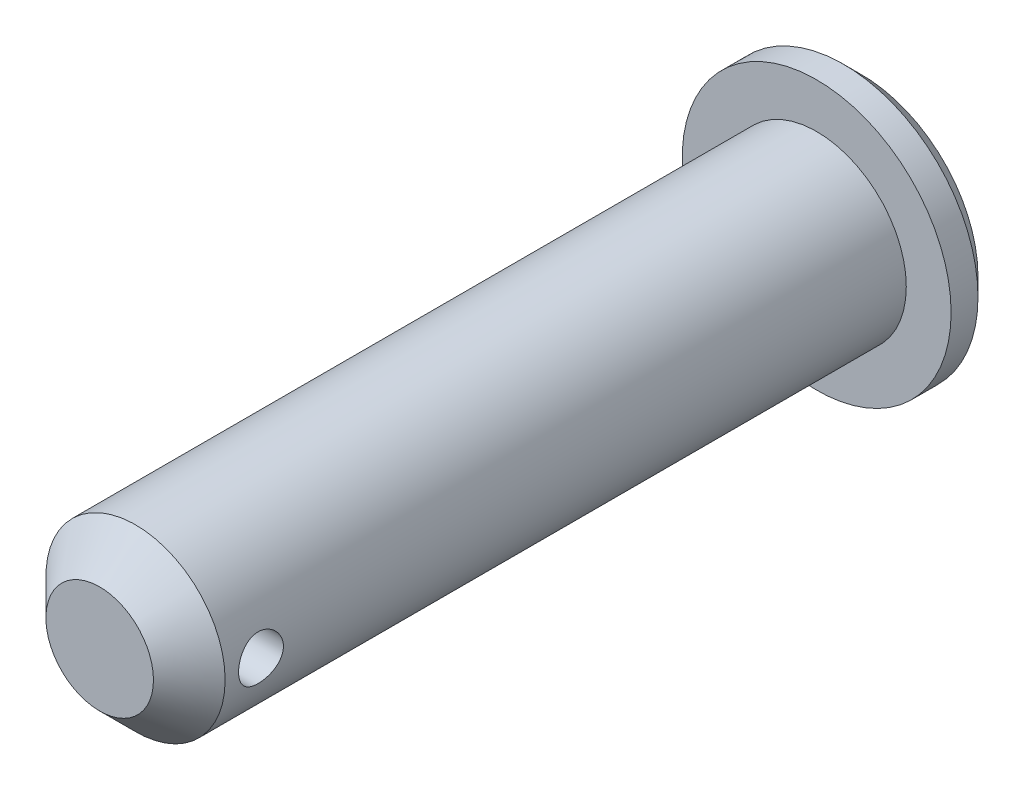
ISO-10303-21;
HEADER;
FILE_DESCRIPTION(('STEP AP214'),'2;1');
FILE_NAME('part.step','',(''),(''),'','','');
FILE_SCHEMA(('AUTOMOTIVE_DESIGN { 1 0 10303 214 1 1 1 1 }'));
ENDSEC;
DATA;
#1=APPLICATION_CONTEXT('core data for automotive mechanical design processes');
#2=APPLICATION_PROTOCOL_DEFINITION('international standard','automotive_design',2000,#1);
#3=PRODUCT_CONTEXT('',#1,'mechanical');
#4=PRODUCT('Part','Part','',(#3));
#5=PRODUCT_RELATED_PRODUCT_CATEGORY('part','',(#4));
#6=PRODUCT_DEFINITION_FORMATION('','',#4);
#7=PRODUCT_DEFINITION_CONTEXT('part definition',#1,'design');
#8=PRODUCT_DEFINITION('design','',#6,#7);
#9=PRODUCT_DEFINITION_SHAPE('','',#8);
#10=(LENGTH_UNIT() NAMED_UNIT(*) SI_UNIT(.MILLI.,.METRE.));
#11=(NAMED_UNIT(*) PLANE_ANGLE_UNIT() SI_UNIT($,.RADIAN.));
#12=(NAMED_UNIT(*) SI_UNIT($,.STERADIAN.) SOLID_ANGLE_UNIT());
#13=UNCERTAINTY_MEASURE_WITH_UNIT(LENGTH_MEASURE(1.E-05),#10,'distance_accuracy_value','');
#14=(GEOMETRIC_REPRESENTATION_CONTEXT(3) GLOBAL_UNCERTAINTY_ASSIGNED_CONTEXT((#13)) GLOBAL_UNIT_ASSIGNED_CONTEXT((#10,
#11,#12)) REPRESENTATION_CONTEXT('',''));
#15=CARTESIAN_POINT('',(0.,0.,0.));
#16=DIRECTION('',(0.,0.,1.));
#17=DIRECTION('',(1.,0.,0.));
#18=AXIS2_PLACEMENT_3D('',#15,#16,#17);
#19=CARTESIAN_POINT('',(0.,0.,0.));
#20=DIRECTION('',(0.,0.,1.));
#21=DIRECTION('',(1.,0.,0.));
#22=AXIS2_PLACEMENT_3D('',#19,#20,#21);
#23=PLANE('',#22);
#24=CARTESIAN_POINT('',(0.,0.,0.));
#25=DIRECTION('',(0.,0.,1.));
#26=DIRECTION('',(1.,0.,0.));
#27=AXIS2_PLACEMENT_3D('',#24,#25,#26);
#28=CIRCLE('',#27,15.);
#29=CARTESIAN_POINT('',(15.,0.,0.));
#30=VERTEX_POINT('',#29);
#31=EDGE_CURVE('E91',#30,#30,#28,.T.);
#32=ORIENTED_EDGE('',*,*,#31,.T.);
#33=EDGE_LOOP('',(#32));
#34=FACE_BOUND('',#33,.T.);
#35=CARTESIAN_POINT('',(0.,0.,0.));
#36=DIRECTION('',(0.,0.,1.));
#37=DIRECTION('',(1.,0.,0.));
#38=AXIS2_PLACEMENT_3D('',#35,#36,#37);
#39=CIRCLE('',#38,10.);
#40=CARTESIAN_POINT('',(10.,0.,0.));
#41=VERTEX_POINT('',#40);
#42=EDGE_CURVE('E95',#41,#41,#39,.T.);
#43=ORIENTED_EDGE('',*,*,#42,.F.);
#44=EDGE_LOOP('',(#43));
#45=FACE_BOUND('',#44,.T.);
#46=ADVANCED_FACE('F26',(#34,#45),#23,.T.);
#47=CARTESIAN_POINT('',(0.,0.,-5.));
#48=DIRECTION('',(0.,0.,1.));
#49=DIRECTION('',(1.,0.,0.));
#50=AXIS2_PLACEMENT_3D('',#47,#48,#49);
#51=CYLINDRICAL_SURFACE('',#50,15.);
#52=CARTESIAN_POINT('',(0.,0.,-2.99999999999999));
#53=DIRECTION('',(0.,0.,1.));
#54=DIRECTION('',(1.,0.,0.));
#55=AXIS2_PLACEMENT_3D('',#52,#53,#54);
#56=CIRCLE('',#55,15.);
#57=CARTESIAN_POINT('',(15.,0.,-2.99999999999999));
#58=VERTEX_POINT('',#57);
#59=EDGE_CURVE('E89',#58,#58,#56,.T.);
#60=ORIENTED_EDGE('',*,*,#59,.T.);
#61=EDGE_LOOP('',(#60));
#62=FACE_BOUND('',#61,.T.);
#63=ORIENTED_EDGE('',*,*,#31,.F.);
#64=EDGE_LOOP('',(#63));
#65=FACE_BOUND('',#64,.T.);
#66=ADVANCED_FACE('F28',(#62,#65),#51,.T.);
#67=CARTESIAN_POINT('',(0.,0.,-5.));
#68=DIRECTION('',(0.,0.,1.));
#69=DIRECTION('',(1.,0.,0.));
#70=AXIS2_PLACEMENT_3D('',#67,#68,#69);
#71=PLANE('',#70);
#72=CARTESIAN_POINT('',(0.,0.,-5.));
#73=DIRECTION('',(0.,0.,1.));
#74=DIRECTION('',(1.,0.,0.));
#75=AXIS2_PLACEMENT_3D('',#72,#73,#74);
#76=CIRCLE('',#75,13.);
#77=CARTESIAN_POINT('',(13.,0.,-5.));
#78=VERTEX_POINT('',#77);
#79=EDGE_CURVE('E43',#78,#78,#76,.F.);
#80=ORIENTED_EDGE('',*,*,#79,.T.);
#81=EDGE_LOOP('',(#80));
#82=FACE_BOUND('',#81,.T.);
#83=ADVANCED_FACE('F73',(#82),#71,.F.);
#84=CARTESIAN_POINT('',(0.,0.,80.));
#85=DIRECTION('',(0.,0.,-1.));
#86=DIRECTION('',(-1.,0.,0.));
#87=AXIS2_PLACEMENT_3D('',#84,#85,#86);
#88=CYLINDRICAL_SURFACE('',#87,10.);
#89=CARTESIAN_POINT('',(-10.,0.,74.5));
#90=CARTESIAN_POINT('',(-9.99999766446687,-0.138126814449552,74.4999961237697));
#91=CARTESIAN_POINT('',(-9.99710963553044,-0.276296929717939,74.4885140820437));
#92=CARTESIAN_POINT('',(-9.98586856383157,-0.548677206284221,74.442958081155));
#93=CARTESIAN_POINT('',(-9.97751242366627,-0.682885078117899,74.4088713174369));
#94=CARTESIAN_POINT('',(-9.9562604388672,-0.943368120304298,74.3192679108965));
#95=CARTESIAN_POINT('',(-9.94337004736764,-1.06965260571668,74.2637770021412));
#96=CARTESIAN_POINT('',(-9.91442239679369,-1.31112021984072,74.1330310165919));
#97=CARTESIAN_POINT('',(-9.89836503090261,-1.42630297391461,74.0577752731351));
#98=CARTESIAN_POINT('',(-9.86445689319489,-1.64466987883486,73.8879986839097));
#99=CARTESIAN_POINT('',(-9.84657845246877,-1.74759281676843,73.7931473750682));
#100=CARTESIAN_POINT('',(-9.81122700196561,-1.93624821200553,73.5875796584849));
#101=CARTESIAN_POINT('',(-9.79375403816446,-2.02197872824865,73.4768614617551));
#102=CARTESIAN_POINT('',(-9.76091292830281,-2.17504423799829,73.240674622105));
#103=CARTESIAN_POINT('',(-9.74557990774685,-2.2420870265419,73.1150112819855));
#104=CARTESIAN_POINT('',(-9.71915824696694,-2.35399484758458,72.8537526472333));
#105=CARTESIAN_POINT('',(-9.70806892824031,-2.39886342573357,72.7181589444466));
#106=CARTESIAN_POINT('',(-9.69167461160538,-2.46425806134128,72.4437608363306));
#107=CARTESIAN_POINT('',(-9.68625818328352,-2.48525378055343,72.30507517327));
#108=CARTESIAN_POINT('',(-9.68148937432652,-2.50376962511068,72.0260523850011));
#109=CARTESIAN_POINT('',(-9.68213600713214,-2.50129356969685,71.8857155321798));
#110=CARTESIAN_POINT('',(-9.68932009194695,-2.47331087439951,71.6109736537578));
#111=CARTESIAN_POINT('',(-9.69571438345489,-2.44836390031773,71.4765072975578));
#112=CARTESIAN_POINT('',(-9.71344516118448,-2.37704031150499,71.2137315818149));
#113=CARTESIAN_POINT('',(-9.72478199948731,-2.33066217011566,71.0854226616185));
#114=CARTESIAN_POINT('',(-9.75125189842765,-2.21731579656197,70.8371033062464));
#115=CARTESIAN_POINT('',(-9.76642212449693,-2.1501444453882,70.717189713684));
#116=CARTESIAN_POINT('',(-9.79882851409985,-1.99726046002492,70.4901354837386));
#117=CARTESIAN_POINT('',(-9.81606503891047,-1.91154458134807,70.3829970865546));
#118=CARTESIAN_POINT('',(-9.85126467566485,-1.72110570780204,70.181327307176));
#119=CARTESIAN_POINT('',(-9.86923449130002,-1.61591043027643,70.0872425165644));
#120=CARTESIAN_POINT('',(-9.90343275964594,-1.39101986250616,69.9179645958935));
#121=CARTESIAN_POINT('',(-9.91966115915679,-1.27132412951323,69.842772042894));
#122=CARTESIAN_POINT('',(-9.94862886823651,-1.02019314780231,69.7132490229593));
#123=CARTESIAN_POINT('',(-9.96135600212878,-0.888718988681034,69.6589910995759));
#124=CARTESIAN_POINT('',(-9.98179861652361,-0.618126680238137,69.5734711571507));
#125=CARTESIAN_POINT('',(-9.98951505565468,-0.479009998584141,69.5422047393031));
#126=CARTESIAN_POINT('',(-9.99892498785624,-0.200899950650046,69.5042373907353));
#127=CARTESIAN_POINT('',(-10.0007675584713,-0.0619945333136845,69.4969282898745));
#128=CARTESIAN_POINT('',(-9.99864674690754,0.215054791335847,69.5054150034258));
#129=CARTESIAN_POINT('',(-9.99468388736421,0.353198766074328,69.5212087379985));
#130=CARTESIAN_POINT('',(-9.98149301878918,0.62269044796082,69.5749515139856));
#131=CARTESIAN_POINT('',(-9.97234390309647,0.754108531614586,69.6125687724616));
#132=CARTESIAN_POINT('',(-9.94981177723595,1.00876215408753,69.7085118067141));
#133=CARTESIAN_POINT('',(-9.93642833949965,1.13199686505442,69.7668396738554));
#134=CARTESIAN_POINT('',(-9.9065551321037,1.36920522404972,69.9037268814578));
#135=CARTESIAN_POINT('',(-9.89001445610999,1.48297573639295,69.9826268539943));
#136=CARTESIAN_POINT('',(-9.85574181979587,1.69587768940552,70.1579831813286));
#137=CARTESIAN_POINT('',(-9.83800965421578,1.79500659828875,70.2544425660294));
#138=CARTESIAN_POINT('',(-9.80281594932498,1.97831761345414,70.4650032680728));
#139=CARTESIAN_POINT('',(-9.78537173637463,2.06207311270184,70.5794795049993));
#140=CARTESIAN_POINT('',(-9.75321463970069,2.20918459835605,70.8212210574476));
#141=CARTESIAN_POINT('',(-9.73850163474941,2.27254149026901,70.9484858049507));
#142=CARTESIAN_POINT('',(-9.71363491194665,2.37658570101223,71.2115095373437));
#143=CARTESIAN_POINT('',(-9.70345425375809,2.41740732773931,71.3472127138538));
#144=CARTESIAN_POINT('',(-9.68877906706585,2.4755760999049,71.6238493964255));
#145=CARTESIAN_POINT('',(-9.68428329504044,2.49292837912652,71.7647817517024));
#146=CARTESIAN_POINT('',(-9.68158168701612,2.50339765056083,72.0435350397694));
#147=CARTESIAN_POINT('',(-9.68319887888035,2.49719649630132,72.1813290585441));
#148=CARTESIAN_POINT('',(-9.69213181672143,2.46229546385366,72.4538398144438));
#149=CARTESIAN_POINT('',(-9.69944744817731,2.43359603781098,72.5885566133553));
#150=CARTESIAN_POINT('',(-9.71885434473222,2.35488553240495,72.8503474317764));
#151=CARTESIAN_POINT('',(-9.73091692061057,2.30500234113404,72.9774621754006));
#152=CARTESIAN_POINT('',(-9.7584625954084,2.18544152267504,73.2216089711893));
#153=CARTESIAN_POINT('',(-9.77394616867808,2.11576115005696,73.3386396219781));
#154=CARTESIAN_POINT('',(-9.80709390439337,1.95644624772859,73.5625910483367));
#155=CARTESIAN_POINT('',(-9.82480441386302,1.86633860485376,73.6691684557066));
#156=CARTESIAN_POINT('',(-9.86013378743769,1.66964895198289,73.8659117413257));
#157=CARTESIAN_POINT('',(-9.87775262878422,1.56306303543524,73.9560737168549));
#158=CARTESIAN_POINT('',(-9.9112942607945,1.33411264450432,74.1190188476077));
#159=CARTESIAN_POINT('',(-9.92718055609783,1.21149737052731,74.1914576894526));
#160=CARTESIAN_POINT('',(-9.95508208291861,0.955443432517459,74.3145791049009));
#161=CARTESIAN_POINT('',(-9.96710008666301,0.822012605727901,74.3652772677476));
#162=CARTESIAN_POINT('',(-9.98413432609236,0.574017088739121,74.4359530505494));
#163=CARTESIAN_POINT('',(-9.99004308421151,0.460633618180115,74.4599187384224));
#164=CARTESIAN_POINT('',(-9.9979767538658,0.231510119227139,74.4919432393699));
#165=CARTESIAN_POINT('',(-10.0000019575149,0.115770268737694,74.5000032488422));
#166=CARTESIAN_POINT('',(-10.,0.,74.5));
#167=B_SPLINE_CURVE_WITH_KNOTS('',3,(#89,#90,#91,#92,#93,#94,#95,#96,#97,#98,#99,#100,#101,#102,
#103,#104,#105,#106,#107,#108,#109,#110,#111,#112,#113,#114,#115,#116,#117,#118,#119,#120,#121,
#122,#123,#124,#125,#126,#127,#128,#129,#130,#131,#132,#133,#134,#135,#136,#137,#138,#139,#140,
#141,#142,#143,#144,#145,#146,#147,#148,#149,#150,#151,#152,#153,#154,#155,#156,#157,#158,#159,
#160,#161,#162,#163,#164,#165,#166),.UNSPECIFIED.,.T.,.F.,(4,2,2,2,2,2,2,2,2,2,2,2,2,2,2,2,2,2,
2,2,2,2,2,2,2,2,2,2,2,2,2,2,2,2,2,2,2,2,4),(0.,0.413956187453149,0.828147062939834,
1.24184150381019,1.65554990028221,2.07690725728566,2.4983121596677,2.92597745909678,
3.3535743528228,3.77260491835118,4.19156730193362,4.6003749501723,5.00921172448933,
5.42217546462,5.83521151399138,6.26002501620568,6.68485149269281,7.11113715020726,
7.5373412281994,7.95263848254329,8.3678983519344,8.77700457528932,9.18615212209353,
9.60255979281123,10.0190393835223,10.44574182013,10.8724253125472,11.2965375769764,
11.7205570543048,12.1323963400749,12.5442273493652,12.9536066760888,13.3630428023797,
13.7831596069298,14.2033761629383,14.6312030917578,15.0587227304538,15.4057040491338,
15.752659267482),.UNSPECIFIED.);
#168=CARTESIAN_POINT('',(-10.,0.,74.5));
#169=VERTEX_POINT('',#168);
#170=EDGE_CURVE('E30',#169,#169,#167,.T.);
#171=ORIENTED_EDGE('',*,*,#170,.T.);
#172=EDGE_LOOP('',(#171));
#173=FACE_BOUND('',#172,.T.);
#174=CARTESIAN_POINT('',(10.,0.,69.5));
#175=CARTESIAN_POINT('',(9.99999766446687,-0.138126814449551,69.5000038762303));
#176=CARTESIAN_POINT('',(9.99710963553044,-0.276296929717939,69.5114859179563));
#177=CARTESIAN_POINT('',(9.98586856383157,-0.548677206284221,69.557041918845));
#178=CARTESIAN_POINT('',(9.97751242366627,-0.682885078117898,69.5911286825631));
#179=CARTESIAN_POINT('',(9.9562604388672,-0.943368120304291,69.6807320891035));
#180=CARTESIAN_POINT('',(9.94337004736764,-1.06965260571667,69.7362229978588));
#181=CARTESIAN_POINT('',(9.91442239679369,-1.31112021984071,69.8669689834081));
#182=CARTESIAN_POINT('',(9.89836503090261,-1.4263029739146,69.9422247268649));
#183=CARTESIAN_POINT('',(9.86445689319489,-1.64466987883486,70.1120013160903));
#184=CARTESIAN_POINT('',(9.84657845246877,-1.74759281676843,70.2068526249318));
#185=CARTESIAN_POINT('',(9.81122700196561,-1.93624821200553,70.4124203415151));
#186=CARTESIAN_POINT('',(9.79375403816446,-2.02197872824865,70.5231385382449));
#187=CARTESIAN_POINT('',(9.76091292830281,-2.17504423799829,70.759325377895));
#188=CARTESIAN_POINT('',(9.74557990774685,-2.2420870265419,70.8849887180145));
#189=CARTESIAN_POINT('',(9.71915824696694,-2.35399484758457,71.1462473527667));
#190=CARTESIAN_POINT('',(9.70806892824031,-2.39886342573357,71.2818410555534));
#191=CARTESIAN_POINT('',(9.69167461160538,-2.46425806134128,71.5562391636694));
#192=CARTESIAN_POINT('',(9.68625818328352,-2.48525378055342,71.69492482673));
#193=CARTESIAN_POINT('',(9.68148937432652,-2.50376962511068,71.9739476149989));
#194=CARTESIAN_POINT('',(9.68213600713214,-2.50129356969685,72.1142844678202));
#195=CARTESIAN_POINT('',(9.68932009194695,-2.47331087439951,72.3890263462422));
#196=CARTESIAN_POINT('',(9.69571438345489,-2.44836390031773,72.5234927024422));
#197=CARTESIAN_POINT('',(9.71344516118448,-2.37704031150499,72.7862684181851));
#198=CARTESIAN_POINT('',(9.72478199948731,-2.33066217011566,72.9145773383815));
#199=CARTESIAN_POINT('',(9.75125189842765,-2.21731579656197,73.1628966937536));
#200=CARTESIAN_POINT('',(9.76642212449693,-2.1501444453882,73.282810286316));
#201=CARTESIAN_POINT('',(9.79882851409985,-1.99726046002492,73.5098645162614));
#202=CARTESIAN_POINT('',(9.81606503891047,-1.91154458134807,73.6170029134454));
#203=CARTESIAN_POINT('',(9.85126467566485,-1.72110570780204,73.818672692824));
#204=CARTESIAN_POINT('',(9.86923449130001,-1.61591043027644,73.9127574834356));
#205=CARTESIAN_POINT('',(9.90343275964594,-1.39101986250617,74.0820354041065));
#206=CARTESIAN_POINT('',(9.91966115915679,-1.27132412951323,74.1572279571059));
#207=CARTESIAN_POINT('',(9.94862886823651,-1.02019314780231,74.2867509770406));
#208=CARTESIAN_POINT('',(9.96135600212878,-0.888718988681034,74.3410089004241));
#209=CARTESIAN_POINT('',(9.98179861652361,-0.618126680238137,74.4265288428493));
#210=CARTESIAN_POINT('',(9.98951505565468,-0.479009998584142,74.4577952606969));
#211=CARTESIAN_POINT('',(9.99892498785624,-0.200899950650047,74.4957626092647));
#212=CARTESIAN_POINT('',(10.0007675584713,-0.0619945333136851,74.5030717101255));
#213=CARTESIAN_POINT('',(9.99864674690754,0.215054791335847,74.4945849965742));
#214=CARTESIAN_POINT('',(9.99468388736421,0.353198766074327,74.4787912620014));
#215=CARTESIAN_POINT('',(9.98149301878918,0.622690447960819,74.4250484860144));
#216=CARTESIAN_POINT('',(9.97234390309647,0.754108531614585,74.3874312275384));
#217=CARTESIAN_POINT('',(9.94981177723595,1.00876215408753,74.2914881932859));
#218=CARTESIAN_POINT('',(9.93642833949965,1.13199686505442,74.2331603261446));
#219=CARTESIAN_POINT('',(9.9065551321037,1.36920522404972,74.0962731185422));
#220=CARTESIAN_POINT('',(9.89001445610999,1.48297573639295,74.0173731460057));
#221=CARTESIAN_POINT('',(9.85574181979587,1.69587768940552,73.8420168186714));
#222=CARTESIAN_POINT('',(9.83800965421578,1.79500659828875,73.7455574339706));
#223=CARTESIAN_POINT('',(9.80281594932498,1.97831761345414,73.5349967319272));
#224=CARTESIAN_POINT('',(9.78537173637463,2.06207311270184,73.4205204950007));
#225=CARTESIAN_POINT('',(9.75321463970069,2.20918459835605,73.1787789425524));
#226=CARTESIAN_POINT('',(9.73850163474941,2.27254149026901,73.0515141950493));
#227=CARTESIAN_POINT('',(9.71363491194665,2.37658570101223,72.7884904626563));
#228=CARTESIAN_POINT('',(9.70345425375809,2.41740732773931,72.6527872861462));
#229=CARTESIAN_POINT('',(9.68877906706585,2.4755760999049,72.3761506035745));
#230=CARTESIAN_POINT('',(9.68428329504044,2.49292837912652,72.2352182482976));
#231=CARTESIAN_POINT('',(9.68158168701612,2.50339765056083,71.9564649602307));
#232=CARTESIAN_POINT('',(9.68319887888035,2.49719649630132,71.8186709414559));
#233=CARTESIAN_POINT('',(9.69213181672143,2.46229546385366,71.5461601855562));
#234=CARTESIAN_POINT('',(9.69944744817731,2.43359603781099,71.4114433866447));
#235=CARTESIAN_POINT('',(9.71885434473222,2.35488553240496,71.1496525682236));
#236=CARTESIAN_POINT('',(9.73091692061057,2.30500234113404,71.0225378245994));
#237=CARTESIAN_POINT('',(9.7584625954084,2.18544152267504,70.7783910288107));
#238=CARTESIAN_POINT('',(9.77394616867808,2.11576115005696,70.6613603780219));
#239=CARTESIAN_POINT('',(9.80709390439337,1.95644624772859,70.4374089516632));
#240=CARTESIAN_POINT('',(9.82480441386302,1.86633860485377,70.3308315442934));
#241=CARTESIAN_POINT('',(9.86013378743769,1.66964895198289,70.1340882586743));
#242=CARTESIAN_POINT('',(9.87775262878422,1.56306303543524,70.043926283145));
#243=CARTESIAN_POINT('',(9.91129426079449,1.33411264450432,69.8809811523923));
#244=CARTESIAN_POINT('',(9.92718055609783,1.21149737052731,69.8085423105474));
#245=CARTESIAN_POINT('',(9.95508208291861,0.95544343251746,69.6854208950991));
#246=CARTESIAN_POINT('',(9.96710008666301,0.822012605727902,69.6347227322524));
#247=CARTESIAN_POINT('',(9.98413432609236,0.574017088739122,69.5640469494506));
#248=CARTESIAN_POINT('',(9.99004308421151,0.460633618180116,69.5400812615776));
#249=CARTESIAN_POINT('',(9.9979767538658,0.231510119227139,69.5080567606301));
#250=CARTESIAN_POINT('',(10.0000019575149,0.115770268737694,69.4999967511578));
#251=CARTESIAN_POINT('',(10.,0.,69.5));
#252=B_SPLINE_CURVE_WITH_KNOTS('',3,(#174,#175,#176,#177,#178,#179,#180,#181,#182,#183,#184,
#185,#186,#187,#188,#189,#190,#191,#192,#193,#194,#195,#196,#197,#198,#199,#200,#201,#202,#203,
#204,#205,#206,#207,#208,#209,#210,#211,#212,#213,#214,#215,#216,#217,#218,#219,#220,#221,#222,
#223,#224,#225,#226,#227,#228,#229,#230,#231,#232,#233,#234,#235,#236,#237,#238,#239,#240,#241,
#242,#243,#244,#245,#246,#247,#248,#249,#250,#251),.UNSPECIFIED.,.T.,.F.,(4,2,2,2,2,2,2,2,2,2,2,
2,2,2,2,2,2,2,2,2,2,2,2,2,2,2,2,2,2,2,2,2,2,2,2,2,2,2,4),(0.,0.413956187453149,
0.828147062939834,1.24184150381017,1.65554990028221,2.07690725728566,2.4983121596677,
2.92597745909678,3.35357435282281,3.77260491835115,4.19156730193362,4.6003749501723,
5.00921172448933,5.42217546462,5.83521151399138,6.26002501620567,6.68485149269281,
7.11113715020726,7.5373412281994,7.95263848254329,8.3678983519344,8.77700457528932,
9.18615212209353,9.60255979281123,10.0190393835223,10.44574182013,10.8724253125472,
11.2965375769764,11.7205570543048,12.1323963400748,12.5442273493652,12.9536066760888,
13.3630428023797,13.7831596069298,14.2033761629383,14.6312030917578,15.0587227304538,
15.4057040491338,15.752659267482),.UNSPECIFIED.);
#253=CARTESIAN_POINT('',(10.,0.,69.5));
#254=VERTEX_POINT('',#253);
#255=EDGE_CURVE('E46',#254,#254,#252,.T.);
#256=ORIENTED_EDGE('',*,*,#255,.T.);
#257=EDGE_LOOP('',(#256));
#258=FACE_BOUND('',#257,.T.);
#259=CARTESIAN_POINT('',(0.,0.,76.));
#260=DIRECTION('',(0.,0.,1.));
#261=DIRECTION('',(1.,0.,0.));
#262=AXIS2_PLACEMENT_3D('',#259,#260,#261);
#263=CIRCLE('',#262,10.);
#264=CARTESIAN_POINT('',(10.,0.,76.));
#265=VERTEX_POINT('',#264);
#266=EDGE_CURVE('E10',#265,#265,#263,.F.);
#267=ORIENTED_EDGE('',*,*,#266,.T.);
#268=EDGE_LOOP('',(#267));
#269=FACE_BOUND('',#268,.T.);
#270=ORIENTED_EDGE('',*,*,#42,.T.);
#271=EDGE_LOOP('',(#270));
#272=FACE_BOUND('',#271,.T.);
#273=ADVANCED_FACE('F50',(#173,#258,#269,#272),#88,.T.);
#274=CARTESIAN_POINT('',(0.,0.,80.));
#275=DIRECTION('',(0.,0.,1.));
#276=DIRECTION('',(1.,0.,0.));
#277=AXIS2_PLACEMENT_3D('',#274,#275,#276);
#278=PLANE('',#277);
#279=CARTESIAN_POINT('',(0.,0.,80.));
#280=DIRECTION('',(0.,0.,1.));
#281=DIRECTION('',(1.,0.,0.));
#282=AXIS2_PLACEMENT_3D('',#279,#280,#281);
#283=CIRCLE('',#282,5.99999999999993);
#284=CARTESIAN_POINT('',(5.99999999999993,0.,80.));
#285=VERTEX_POINT('',#284);
#286=EDGE_CURVE('E38',#285,#285,#283,.T.);
#287=ORIENTED_EDGE('',*,*,#286,.T.);
#288=EDGE_LOOP('',(#287));
#289=FACE_BOUND('',#288,.T.);
#290=ADVANCED_FACE('F66',(#289),#278,.T.);
#291=CARTESIAN_POINT('',(0.,0.,-2.99999999999999));
#292=DIRECTION('',(0.,0.,1.));
#293=DIRECTION('',(1.,0.,0.));
#294=AXIS2_PLACEMENT_3D('',#291,#292,#293);
#295=CONICAL_SURFACE('',#294,15.,0.785398163397453);
#296=ORIENTED_EDGE('',*,*,#79,.F.);
#297=EDGE_LOOP('',(#296));
#298=FACE_BOUND('',#297,.T.);
#299=ORIENTED_EDGE('',*,*,#59,.F.);
#300=EDGE_LOOP('',(#299));
#301=FACE_BOUND('',#300,.T.);
#302=ADVANCED_FACE('F63',(#298,#301),#295,.T.);
#303=CARTESIAN_POINT('',(0.,0.,80.));
#304=DIRECTION('',(0.,0.,-1.));
#305=DIRECTION('',(-1.,0.,0.));
#306=AXIS2_PLACEMENT_3D('',#303,#304,#305);
#307=CONICAL_SURFACE('',#306,5.99999999999993,0.785398163397453);
#308=ORIENTED_EDGE('',*,*,#266,.F.);
#309=EDGE_LOOP('',(#308));
#310=FACE_BOUND('',#309,.T.);
#311=ORIENTED_EDGE('',*,*,#286,.F.);
#312=EDGE_LOOP('',(#311));
#313=FACE_BOUND('',#312,.T.);
#314=ADVANCED_FACE('F58',(#310,#313),#307,.T.);
#315=CARTESIAN_POINT('',(-15.,0.,72.));
#316=DIRECTION('',(1.,0.,0.));
#317=DIRECTION('',(0.,0.,-1.));
#318=AXIS2_PLACEMENT_3D('',#315,#316,#317);
#319=CYLINDRICAL_SURFACE('',#318,2.5);
#320=ORIENTED_EDGE('',*,*,#255,.F.);
#321=EDGE_LOOP('',(#320));
#322=FACE_BOUND('',#321,.T.);
#323=ORIENTED_EDGE('',*,*,#170,.F.);
#324=EDGE_LOOP('',(#323));
#325=FACE_BOUND('',#324,.T.);
#326=ADVANCED_FACE('F54',(#322,#325),#319,.F.);
#327=CLOSED_SHELL('',(#46,#66,#83,#273,#290,#302,#314,#326));
#328=MANIFOLD_SOLID_BREP('B2',#327);
#329=ADVANCED_BREP_SHAPE_REPRESENTATION('',(#18,#328),#14);
#330=SHAPE_DEFINITION_REPRESENTATION(#9,#329);
ENDSEC;
END-ISO-10303-21;
